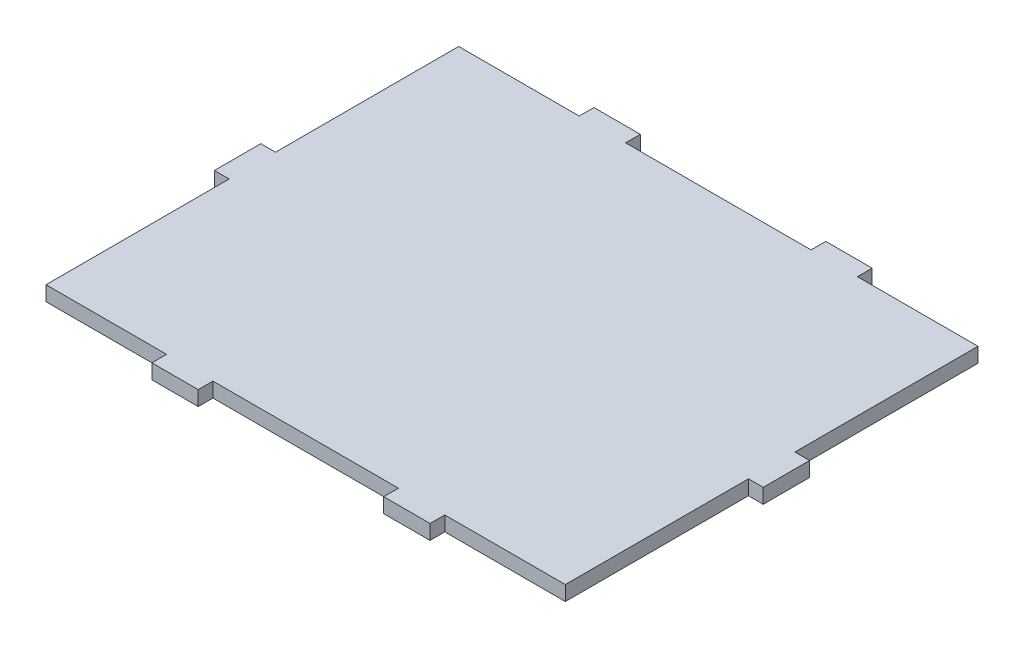
ISO-10303-21;
HEADER;
FILE_DESCRIPTION(('STEP AP214'),'2;1');
FILE_NAME('part.step','',(''),(''),'','','');
FILE_SCHEMA(('AUTOMOTIVE_DESIGN { 1 0 10303 214 1 1 1 1 }'));
ENDSEC;
DATA;
#1=APPLICATION_CONTEXT('core data for automotive mechanical design processes');
#2=APPLICATION_PROTOCOL_DEFINITION('international standard','automotive_design',2000,#1);
#3=PRODUCT_CONTEXT('',#1,'mechanical');
#4=PRODUCT('Part','Part','',(#3));
#5=PRODUCT_RELATED_PRODUCT_CATEGORY('part','',(#4));
#6=PRODUCT_DEFINITION_FORMATION('','',#4);
#7=PRODUCT_DEFINITION_CONTEXT('part definition',#1,'design');
#8=PRODUCT_DEFINITION('design','',#6,#7);
#9=PRODUCT_DEFINITION_SHAPE('','',#8);
#10=(LENGTH_UNIT() NAMED_UNIT(*) SI_UNIT(.MILLI.,.METRE.));
#11=(NAMED_UNIT(*) PLANE_ANGLE_UNIT() SI_UNIT($,.RADIAN.));
#12=(NAMED_UNIT(*) SI_UNIT($,.STERADIAN.) SOLID_ANGLE_UNIT());
#13=UNCERTAINTY_MEASURE_WITH_UNIT(LENGTH_MEASURE(1.E-05),#10,'distance_accuracy_value','');
#14=(GEOMETRIC_REPRESENTATION_CONTEXT(3) GLOBAL_UNCERTAINTY_ASSIGNED_CONTEXT((#13)) GLOBAL_UNIT_ASSIGNED_CONTEXT((#10,
#11,#12)) REPRESENTATION_CONTEXT('',''));
#15=CARTESIAN_POINT('',(0.,0.,0.));
#16=DIRECTION('',(0.,0.,1.));
#17=DIRECTION('',(1.,0.,0.));
#18=AXIS2_PLACEMENT_3D('',#15,#16,#17);
#19=CARTESIAN_POINT('',(56.,3.175,47.675));
#20=DIRECTION('',(-1.,0.,0.));
#21=DIRECTION('',(0.,0.,1.));
#22=AXIS2_PLACEMENT_3D('',#19,#20,#21);
#23=PLANE('',#22);
#24=DIRECTION('',(0.,-1.,0.));
#25=VECTOR('',#24,1.);
#26=CARTESIAN_POINT('',(56.,3.175,5.));
#27=LINE('',#26,#25);
#28=CARTESIAN_POINT('',(56.,3.175,5.));
#29=VERTEX_POINT('',#28);
#30=CARTESIAN_POINT('',(56.,0.,5.));
#31=VERTEX_POINT('',#30);
#32=EDGE_CURVE('E240',#29,#31,#27,.T.);
#33=ORIENTED_EDGE('',*,*,#32,.F.);
#34=DIRECTION('',(0.,0.,-1.));
#35=VECTOR('',#34,1.);
#36=CARTESIAN_POINT('',(56.,3.175,47.675));
#37=LINE('',#36,#35);
#38=CARTESIAN_POINT('',(56.,3.175,44.5));
#39=VERTEX_POINT('',#38);
#40=EDGE_CURVE('E281',#39,#29,#37,.T.);
#41=ORIENTED_EDGE('',*,*,#40,.F.);
#42=DIRECTION('',(0.,1.,0.));
#43=VECTOR('',#42,1.);
#44=CARTESIAN_POINT('',(56.,0.,44.5));
#45=LINE('',#44,#43);
#46=CARTESIAN_POINT('',(56.,0.,44.5));
#47=VERTEX_POINT('',#46);
#48=EDGE_CURVE('E578',#47,#39,#45,.T.);
#49=ORIENTED_EDGE('',*,*,#48,.F.);
#50=DIRECTION('',(0.,0.,-1.));
#51=VECTOR('',#50,1.);
#52=CARTESIAN_POINT('',(56.,0.,47.675));
#53=LINE('',#52,#51);
#54=EDGE_CURVE('E56',#47,#31,#53,.T.);
#55=ORIENTED_EDGE('',*,*,#54,.T.);
#56=EDGE_LOOP('',(#33,#41,#49,#55));
#57=FACE_BOUND('',#56,.T.);
#58=ADVANCED_FACE('F32',(#57),#23,.F.);
#59=DIRECTION('',(0.,1.,0.));
#60=VECTOR('',#59,1.);
#61=CARTESIAN_POINT('',(56.,3.175,-5.));
#62=LINE('',#61,#60);
#63=CARTESIAN_POINT('',(56.,0.,-5.));
#64=VERTEX_POINT('',#63);
#65=CARTESIAN_POINT('',(56.,3.175,-5.));
#66=VERTEX_POINT('',#65);
#67=EDGE_CURVE('E48',#64,#66,#62,.T.);
#68=ORIENTED_EDGE('',*,*,#67,.F.);
#69=CARTESIAN_POINT('',(56.,0.,-44.5));
#70=VERTEX_POINT('',#69);
#71=EDGE_CURVE('E266',#64,#70,#53,.T.);
#72=ORIENTED_EDGE('',*,*,#71,.T.);
#73=DIRECTION('',(0.,1.,0.));
#74=VECTOR('',#73,1.);
#75=CARTESIAN_POINT('',(56.,0.,-44.5));
#76=LINE('',#75,#74);
#77=CARTESIAN_POINT('',(56.,3.175,-44.5));
#78=VERTEX_POINT('',#77);
#79=EDGE_CURVE('E462',#70,#78,#76,.T.);
#80=ORIENTED_EDGE('',*,*,#79,.T.);
#81=EDGE_CURVE('E286',#66,#78,#37,.T.);
#82=ORIENTED_EDGE('',*,*,#81,.F.);
#83=EDGE_LOOP('',(#68,#72,#80,#82));
#84=FACE_BOUND('',#83,.T.);
#85=ADVANCED_FACE('F515',(#84),#23,.F.);
#86=CARTESIAN_POINT('',(-56.,3.175,47.675));
#87=DIRECTION('',(1.,0.,0.));
#88=DIRECTION('',(0.,0.,-1.));
#89=AXIS2_PLACEMENT_3D('',#86,#87,#88);
#90=PLANE('',#89);
#91=DIRECTION('',(0.,-1.,0.));
#92=VECTOR('',#91,1.);
#93=CARTESIAN_POINT('',(-56.,3.175,-5.));
#94=LINE('',#93,#92);
#95=CARTESIAN_POINT('',(-56.,3.175,-5.));
#96=VERTEX_POINT('',#95);
#97=CARTESIAN_POINT('',(-56.,0.,-5.));
#98=VERTEX_POINT('',#97);
#99=EDGE_CURVE('E241',#96,#98,#94,.T.);
#100=ORIENTED_EDGE('',*,*,#99,.F.);
#101=DIRECTION('',(0.,0.,1.));
#102=VECTOR('',#101,1.);
#103=CARTESIAN_POINT('',(-56.,3.175,47.675));
#104=LINE('',#103,#102);
#105=CARTESIAN_POINT('',(-56.,3.175,-44.5));
#106=VERTEX_POINT('',#105);
#107=EDGE_CURVE('E309',#106,#96,#104,.T.);
#108=ORIENTED_EDGE('',*,*,#107,.F.);
#109=DIRECTION('',(0.,1.,0.));
#110=VECTOR('',#109,1.);
#111=CARTESIAN_POINT('',(-56.,0.,-44.5));
#112=LINE('',#111,#110);
#113=CARTESIAN_POINT('',(-56.,0.,-44.5));
#114=VERTEX_POINT('',#113);
#115=EDGE_CURVE('E338',#114,#106,#112,.T.);
#116=ORIENTED_EDGE('',*,*,#115,.F.);
#117=DIRECTION('',(0.,0.,1.));
#118=VECTOR('',#117,1.);
#119=CARTESIAN_POINT('',(-56.,0.,47.675));
#120=LINE('',#119,#118);
#121=EDGE_CURVE('E315',#114,#98,#120,.T.);
#122=ORIENTED_EDGE('',*,*,#121,.T.);
#123=EDGE_LOOP('',(#100,#108,#116,#122));
#124=FACE_BOUND('',#123,.T.);
#125=ADVANCED_FACE('F336',(#124),#90,.F.);
#126=DIRECTION('',(0.,1.,0.));
#127=VECTOR('',#126,1.);
#128=CARTESIAN_POINT('',(-56.,3.175,5.));
#129=LINE('',#128,#127);
#130=CARTESIAN_POINT('',(-56.,0.,5.));
#131=VERTEX_POINT('',#130);
#132=CARTESIAN_POINT('',(-56.,3.175,5.));
#133=VERTEX_POINT('',#132);
#134=EDGE_CURVE('E244',#131,#133,#129,.T.);
#135=ORIENTED_EDGE('',*,*,#134,.F.);
#136=CARTESIAN_POINT('',(-56.,0.,44.5));
#137=VERTEX_POINT('',#136);
#138=EDGE_CURVE('E312',#131,#137,#120,.T.);
#139=ORIENTED_EDGE('',*,*,#138,.T.);
#140=DIRECTION('',(0.,1.,0.));
#141=VECTOR('',#140,1.);
#142=CARTESIAN_POINT('',(-56.,0.,44.5));
#143=LINE('',#142,#141);
#144=CARTESIAN_POINT('',(-56.,3.175,44.5));
#145=VERTEX_POINT('',#144);
#146=EDGE_CURVE('E391',#137,#145,#143,.T.);
#147=ORIENTED_EDGE('',*,*,#146,.T.);
#148=EDGE_CURVE('E303',#133,#145,#104,.T.);
#149=ORIENTED_EDGE('',*,*,#148,.F.);
#150=EDGE_LOOP('',(#135,#139,#147,#149));
#151=FACE_BOUND('',#150,.T.);
#152=ADVANCED_FACE('F390',(#151),#90,.F.);
#153=CARTESIAN_POINT('',(-56.,3.175,47.675));
#154=DIRECTION('',(0.,0.,-1.));
#155=DIRECTION('',(-1.,0.,0.));
#156=AXIS2_PLACEMENT_3D('',#153,#154,#155);
#157=PLANE('',#156);
#158=DIRECTION('',(1.,0.,0.));
#159=VECTOR('',#158,1.);
#160=CARTESIAN_POINT('',(-56.,3.175,47.675));
#161=LINE('',#160,#159);
#162=CARTESIAN_POINT('',(-30.,3.175,47.675));
#163=VERTEX_POINT('',#162);
#164=CARTESIAN_POINT('',(-20.,3.175,47.675));
#165=VERTEX_POINT('',#164);
#166=EDGE_CURVE('E11',#163,#165,#161,.T.);
#167=ORIENTED_EDGE('',*,*,#166,.F.);
#168=DIRECTION('',(0.,1.,0.));
#169=VECTOR('',#168,1.);
#170=CARTESIAN_POINT('',(-30.,0.,47.675));
#171=LINE('',#170,#169);
#172=CARTESIAN_POINT('',(-30.,0.,47.675));
#173=VERTEX_POINT('',#172);
#174=EDGE_CURVE('E397',#173,#163,#171,.T.);
#175=ORIENTED_EDGE('',*,*,#174,.F.);
#176=DIRECTION('',(1.,0.,0.));
#177=VECTOR('',#176,1.);
#178=CARTESIAN_POINT('',(-56.,0.,47.675));
#179=LINE('',#178,#177);
#180=CARTESIAN_POINT('',(-20.,0.,47.675));
#181=VERTEX_POINT('',#180);
#182=EDGE_CURVE('E291',#173,#181,#179,.T.);
#183=ORIENTED_EDGE('',*,*,#182,.T.);
#184=DIRECTION('',(0.,1.,0.));
#185=VECTOR('',#184,1.);
#186=CARTESIAN_POINT('',(-20.,0.,47.675));
#187=LINE('',#186,#185);
#188=EDGE_CURVE('E415',#181,#165,#187,.T.);
#189=ORIENTED_EDGE('',*,*,#188,.T.);
#190=EDGE_LOOP('',(#167,#175,#183,#189));
#191=FACE_BOUND('',#190,.T.);
#192=ADVANCED_FACE('F546',(#191),#157,.F.);
#193=CARTESIAN_POINT('',(-56.,3.175,-47.675));
#194=DIRECTION('',(0.,0.,1.));
#195=DIRECTION('',(1.,0.,0.));
#196=AXIS2_PLACEMENT_3D('',#193,#194,#195);
#197=PLANE('',#196);
#198=DIRECTION('',(-1.,0.,0.));
#199=VECTOR('',#198,1.);
#200=CARTESIAN_POINT('',(-56.,0.,-47.675));
#201=LINE('',#200,#199);
#202=CARTESIAN_POINT('',(-20.,0.,-47.675));
#203=VERTEX_POINT('',#202);
#204=CARTESIAN_POINT('',(-30.,0.,-47.675));
#205=VERTEX_POINT('',#204);
#206=EDGE_CURVE('E508',#203,#205,#201,.T.);
#207=ORIENTED_EDGE('',*,*,#206,.T.);
#208=DIRECTION('',(0.,1.,0.));
#209=VECTOR('',#208,1.);
#210=CARTESIAN_POINT('',(-30.,0.,-47.675));
#211=LINE('',#210,#209);
#212=CARTESIAN_POINT('',(-30.,3.175,-47.675));
#213=VERTEX_POINT('',#212);
#214=EDGE_CURVE('E440',#205,#213,#211,.T.);
#215=ORIENTED_EDGE('',*,*,#214,.T.);
#216=DIRECTION('',(-1.,0.,0.));
#217=VECTOR('',#216,1.);
#218=CARTESIAN_POINT('',(-56.,3.175,-47.675));
#219=LINE('',#218,#217);
#220=CARTESIAN_POINT('',(-20.,3.175,-47.675));
#221=VERTEX_POINT('',#220);
#222=EDGE_CURVE('E285',#221,#213,#219,.T.);
#223=ORIENTED_EDGE('',*,*,#222,.F.);
#224=DIRECTION('',(0.,1.,0.));
#225=VECTOR('',#224,1.);
#226=CARTESIAN_POINT('',(-20.,0.,-47.675));
#227=LINE('',#226,#225);
#228=EDGE_CURVE('E483',#203,#221,#227,.T.);
#229=ORIENTED_EDGE('',*,*,#228,.F.);
#230=EDGE_LOOP('',(#207,#215,#223,#229));
#231=FACE_BOUND('',#230,.T.);
#232=ADVANCED_FACE('F551',(#231),#197,.F.);
#233=CARTESIAN_POINT('',(30.,3.175,-47.675));
#234=VERTEX_POINT('',#233);
#235=CARTESIAN_POINT('',(20.,3.175,-47.675));
#236=VERTEX_POINT('',#235);
#237=EDGE_CURVE('E289',#234,#236,#219,.T.);
#238=ORIENTED_EDGE('',*,*,#237,.F.);
#239=DIRECTION('',(0.,1.,0.));
#240=VECTOR('',#239,1.);
#241=CARTESIAN_POINT('',(30.,0.,-47.675));
#242=LINE('',#241,#240);
#243=CARTESIAN_POINT('',(30.,0.,-47.675));
#244=VERTEX_POINT('',#243);
#245=EDGE_CURVE('E459',#244,#234,#242,.T.);
#246=ORIENTED_EDGE('',*,*,#245,.F.);
#247=CARTESIAN_POINT('',(20.,0.,-47.675));
#248=VERTEX_POINT('',#247);
#249=EDGE_CURVE('E316',#244,#248,#201,.T.);
#250=ORIENTED_EDGE('',*,*,#249,.T.);
#251=DIRECTION('',(0.,1.,0.));
#252=VECTOR('',#251,1.);
#253=CARTESIAN_POINT('',(20.,0.,-47.675));
#254=LINE('',#253,#252);
#255=EDGE_CURVE('E485',#248,#236,#254,.T.);
#256=ORIENTED_EDGE('',*,*,#255,.T.);
#257=EDGE_LOOP('',(#238,#246,#250,#256));
#258=FACE_BOUND('',#257,.T.);
#259=ADVANCED_FACE('F505',(#258),#197,.F.);
#260=CARTESIAN_POINT('',(20.,0.,47.675));
#261=VERTEX_POINT('',#260);
#262=CARTESIAN_POINT('',(30.,0.,47.675));
#263=VERTEX_POINT('',#262);
#264=EDGE_CURVE('E321',#261,#263,#179,.T.);
#265=ORIENTED_EDGE('',*,*,#264,.T.);
#266=DIRECTION('',(0.,1.,0.));
#267=VECTOR('',#266,1.);
#268=CARTESIAN_POINT('',(30.,0.,47.675));
#269=LINE('',#268,#267);
#270=CARTESIAN_POINT('',(30.,3.175,47.675));
#271=VERTEX_POINT('',#270);
#272=EDGE_CURVE('E576',#263,#271,#269,.T.);
#273=ORIENTED_EDGE('',*,*,#272,.T.);
#274=CARTESIAN_POINT('',(20.,3.175,47.675));
#275=VERTEX_POINT('',#274);
#276=EDGE_CURVE('E40',#275,#271,#161,.T.);
#277=ORIENTED_EDGE('',*,*,#276,.F.);
#278=DIRECTION('',(0.,1.,0.));
#279=VECTOR('',#278,1.);
#280=CARTESIAN_POINT('',(20.,0.,47.675));
#281=LINE('',#280,#279);
#282=EDGE_CURVE('E428',#261,#275,#281,.T.);
#283=ORIENTED_EDGE('',*,*,#282,.F.);
#284=EDGE_LOOP('',(#265,#273,#277,#283));
#285=FACE_BOUND('',#284,.T.);
#286=ADVANCED_FACE('F548',(#285),#157,.F.);
#287=CARTESIAN_POINT('',(0.,3.175,0.));
#288=DIRECTION('',(0.,-1.,0.));
#289=DIRECTION('',(0.,0.,-1.));
#290=AXIS2_PLACEMENT_3D('',#287,#288,#289);
#291=PLANE('',#290);
#292=ORIENTED_EDGE('',*,*,#276,.T.);
#293=DIRECTION('',(0.,0.,1.));
#294=VECTOR('',#293,1.);
#295=CARTESIAN_POINT('',(30.,3.175,44.5));
#296=LINE('',#295,#294);
#297=CARTESIAN_POINT('',(30.,3.175,44.5));
#298=VERTEX_POINT('',#297);
#299=EDGE_CURVE('E347',#298,#271,#296,.T.);
#300=ORIENTED_EDGE('',*,*,#299,.F.);
#301=DIRECTION('',(-1.,0.,0.));
#302=VECTOR('',#301,1.);
#303=CARTESIAN_POINT('',(30.,3.175,44.5));
#304=LINE('',#303,#302);
#305=EDGE_CURVE('E284',#39,#298,#304,.T.);
#306=ORIENTED_EDGE('',*,*,#305,.F.);
#307=ORIENTED_EDGE('',*,*,#40,.T.);
#308=DIRECTION('',(-1.,0.,0.));
#309=VECTOR('',#308,1.);
#310=CARTESIAN_POINT('',(59.175,3.175,5.));
#311=LINE('',#310,#309);
#312=CARTESIAN_POINT('',(59.175,3.175,5.));
#313=VERTEX_POINT('',#312);
#314=EDGE_CURVE('E254',#313,#29,#311,.T.);
#315=ORIENTED_EDGE('',*,*,#314,.F.);
#316=DIRECTION('',(0.,0.,1.));
#317=VECTOR('',#316,1.);
#318=CARTESIAN_POINT('',(59.175,3.175,5.));
#319=LINE('',#318,#317);
#320=CARTESIAN_POINT('',(59.175,3.175,-5.));
#321=VERTEX_POINT('',#320);
#322=EDGE_CURVE('E234',#321,#313,#319,.T.);
#323=ORIENTED_EDGE('',*,*,#322,.F.);
#324=DIRECTION('',(-1.,0.,0.));
#325=VECTOR('',#324,1.);
#326=CARTESIAN_POINT('',(59.175,3.175,-5.));
#327=LINE('',#326,#325);
#328=EDGE_CURVE('E246',#321,#66,#327,.T.);
#329=ORIENTED_EDGE('',*,*,#328,.T.);
#330=ORIENTED_EDGE('',*,*,#81,.T.);
#331=DIRECTION('',(1.,0.,0.));
#332=VECTOR('',#331,1.);
#333=CARTESIAN_POINT('',(30.,3.175,-44.5));
#334=LINE('',#333,#332);
#335=CARTESIAN_POINT('',(30.,3.175,-44.5));
#336=VERTEX_POINT('',#335);
#337=EDGE_CURVE('E451',#336,#78,#334,.T.);
#338=ORIENTED_EDGE('',*,*,#337,.F.);
#339=DIRECTION('',(0.,0.,1.));
#340=VECTOR('',#339,1.);
#341=CARTESIAN_POINT('',(30.,3.175,-47.675));
#342=LINE('',#341,#340);
#343=EDGE_CURVE('E443',#234,#336,#342,.T.);
#344=ORIENTED_EDGE('',*,*,#343,.F.);
#345=ORIENTED_EDGE('',*,*,#237,.T.);
#346=DIRECTION('',(0.,0.,-1.));
#347=VECTOR('',#346,1.);
#348=CARTESIAN_POINT('',(20.,3.175,-47.675));
#349=LINE('',#348,#347);
#350=CARTESIAN_POINT('',(20.,3.175,-44.5));
#351=VERTEX_POINT('',#350);
#352=EDGE_CURVE('E470',#351,#236,#349,.T.);
#353=ORIENTED_EDGE('',*,*,#352,.F.);
#354=DIRECTION('',(1.,0.,0.));
#355=VECTOR('',#354,1.);
#356=CARTESIAN_POINT('',(-20.,3.175,-44.5));
#357=LINE('',#356,#355);
#358=CARTESIAN_POINT('',(-20.,3.175,-44.5));
#359=VERTEX_POINT('',#358);
#360=EDGE_CURVE('E478',#359,#351,#357,.T.);
#361=ORIENTED_EDGE('',*,*,#360,.F.);
#362=DIRECTION('',(0.,0.,1.));
#363=VECTOR('',#362,1.);
#364=CARTESIAN_POINT('',(-20.,3.175,-47.675));
#365=LINE('',#364,#363);
#366=EDGE_CURVE('E461',#221,#359,#365,.T.);
#367=ORIENTED_EDGE('',*,*,#366,.F.);
#368=ORIENTED_EDGE('',*,*,#222,.T.);
#369=DIRECTION('',(0.,0.,-1.));
#370=VECTOR('',#369,1.);
#371=CARTESIAN_POINT('',(-30.,3.175,-47.675));
#372=LINE('',#371,#370);
#373=CARTESIAN_POINT('',(-30.,3.175,-44.5));
#374=VERTEX_POINT('',#373);
#375=EDGE_CURVE('E434',#374,#213,#372,.T.);
#376=ORIENTED_EDGE('',*,*,#375,.F.);
#377=DIRECTION('',(1.,0.,0.));
#378=VECTOR('',#377,1.);
#379=CARTESIAN_POINT('',(-56.,3.175,-44.5));
#380=LINE('',#379,#378);
#381=EDGE_CURVE('E425',#106,#374,#380,.T.);
#382=ORIENTED_EDGE('',*,*,#381,.F.);
#383=ORIENTED_EDGE('',*,*,#107,.T.);
#384=DIRECTION('',(1.,0.,0.));
#385=VECTOR('',#384,1.);
#386=CARTESIAN_POINT('',(-59.175,3.175,-5.));
#387=LINE('',#386,#385);
#388=CARTESIAN_POINT('',(-59.175,3.175,-5.));
#389=VERTEX_POINT('',#388);
#390=EDGE_CURVE('E353',#389,#96,#387,.T.);
#391=ORIENTED_EDGE('',*,*,#390,.F.);
#392=DIRECTION('',(0.,0.,-1.));
#393=VECTOR('',#392,1.);
#394=CARTESIAN_POINT('',(-59.175,3.175,-5.));
#395=LINE('',#394,#393);
#396=CARTESIAN_POINT('',(-59.175,3.175,5.));
#397=VERTEX_POINT('',#396);
#398=EDGE_CURVE('E356',#397,#389,#395,.T.);
#399=ORIENTED_EDGE('',*,*,#398,.F.);
#400=DIRECTION('',(1.,0.,0.));
#401=VECTOR('',#400,1.);
#402=CARTESIAN_POINT('',(-59.175,3.175,5.));
#403=LINE('',#402,#401);
#404=EDGE_CURVE('E355',#397,#133,#403,.T.);
#405=ORIENTED_EDGE('',*,*,#404,.T.);
#406=ORIENTED_EDGE('',*,*,#148,.T.);
#407=DIRECTION('',(-1.,0.,0.));
#408=VECTOR('',#407,1.);
#409=CARTESIAN_POINT('',(-30.,3.175,44.5));
#410=LINE('',#409,#408);
#411=CARTESIAN_POINT('',(-30.,3.175,44.5));
#412=VERTEX_POINT('',#411);
#413=EDGE_CURVE('E396',#412,#145,#410,.T.);
#414=ORIENTED_EDGE('',*,*,#413,.F.);
#415=DIRECTION('',(0.,0.,-1.));
#416=VECTOR('',#415,1.);
#417=CARTESIAN_POINT('',(-30.,3.175,44.5));
#418=LINE('',#417,#416);
#419=EDGE_CURVE('E566',#163,#412,#418,.T.);
#420=ORIENTED_EDGE('',*,*,#419,.F.);
#421=ORIENTED_EDGE('',*,*,#166,.T.);
#422=DIRECTION('',(0.,0.,1.));
#423=VECTOR('',#422,1.);
#424=CARTESIAN_POINT('',(-20.,3.175,47.675));
#425=LINE('',#424,#423);
#426=CARTESIAN_POINT('',(-20.,3.175,44.5));
#427=VERTEX_POINT('',#426);
#428=EDGE_CURVE('E400',#427,#165,#425,.T.);
#429=ORIENTED_EDGE('',*,*,#428,.F.);
#430=DIRECTION('',(-1.,0.,0.));
#431=VECTOR('',#430,1.);
#432=CARTESIAN_POINT('',(-20.,3.175,44.5));
#433=LINE('',#432,#431);
#434=CARTESIAN_POINT('',(20.,3.175,44.5));
#435=VERTEX_POINT('',#434);
#436=EDGE_CURVE('E409',#435,#427,#433,.T.);
#437=ORIENTED_EDGE('',*,*,#436,.F.);
#438=DIRECTION('',(0.,0.,-1.));
#439=VECTOR('',#438,1.);
#440=CARTESIAN_POINT('',(20.,3.175,47.675));
#441=LINE('',#440,#439);
#442=EDGE_CURVE('E418',#275,#435,#441,.T.);
#443=ORIENTED_EDGE('',*,*,#442,.F.);
#444=EDGE_LOOP('',(#292,#300,#306,#307,#315,#323,#329,#330,#338,#344,#345,#353,#361,#367,#368,
#376,#382,#383,#391,#399,#405,#406,#414,#420,#421,#429,#437,#443));
#445=FACE_BOUND('',#444,.T.);
#446=ADVANCED_FACE('F277',(#445),#291,.F.);
#447=CARTESIAN_POINT('',(0.,0.,0.));
#448=DIRECTION('',(0.,-1.,0.));
#449=DIRECTION('',(0.,0.,-1.));
#450=AXIS2_PLACEMENT_3D('',#447,#448,#449);
#451=PLANE('',#450);
#452=DIRECTION('',(0.,0.,1.));
#453=VECTOR('',#452,1.);
#454=CARTESIAN_POINT('',(30.,0.,44.5));
#455=LINE('',#454,#453);
#456=CARTESIAN_POINT('',(30.,0.,44.5));
#457=VERTEX_POINT('',#456);
#458=EDGE_CURVE('E369',#457,#263,#455,.T.);
#459=ORIENTED_EDGE('',*,*,#458,.T.);
#460=ORIENTED_EDGE('',*,*,#264,.F.);
#461=DIRECTION('',(0.,0.,-1.));
#462=VECTOR('',#461,1.);
#463=CARTESIAN_POINT('',(20.,0.,47.675));
#464=LINE('',#463,#462);
#465=CARTESIAN_POINT('',(20.,0.,44.5));
#466=VERTEX_POINT('',#465);
#467=EDGE_CURVE('E408',#261,#466,#464,.T.);
#468=ORIENTED_EDGE('',*,*,#467,.T.);
#469=DIRECTION('',(-1.,0.,0.));
#470=VECTOR('',#469,1.);
#471=CARTESIAN_POINT('',(-20.,0.,44.5));
#472=LINE('',#471,#470);
#473=CARTESIAN_POINT('',(-20.,0.,44.5));
#474=VERTEX_POINT('',#473);
#475=EDGE_CURVE('E412',#466,#474,#472,.T.);
#476=ORIENTED_EDGE('',*,*,#475,.T.);
#477=DIRECTION('',(0.,0.,1.));
#478=VECTOR('',#477,1.);
#479=CARTESIAN_POINT('',(-20.,0.,47.675));
#480=LINE('',#479,#478);
#481=EDGE_CURVE('E405',#474,#181,#480,.T.);
#482=ORIENTED_EDGE('',*,*,#481,.T.);
#483=ORIENTED_EDGE('',*,*,#182,.F.);
#484=DIRECTION('',(0.,0.,-1.));
#485=VECTOR('',#484,1.);
#486=CARTESIAN_POINT('',(-30.,0.,44.5));
#487=LINE('',#486,#485);
#488=CARTESIAN_POINT('',(-30.,0.,44.5));
#489=VERTEX_POINT('',#488);
#490=EDGE_CURVE('E586',#173,#489,#487,.T.);
#491=ORIENTED_EDGE('',*,*,#490,.T.);
#492=DIRECTION('',(-1.,0.,0.));
#493=VECTOR('',#492,1.);
#494=CARTESIAN_POINT('',(-30.,0.,44.5));
#495=LINE('',#494,#493);
#496=EDGE_CURVE('E386',#489,#137,#495,.T.);
#497=ORIENTED_EDGE('',*,*,#496,.T.);
#498=ORIENTED_EDGE('',*,*,#138,.F.);
#499=DIRECTION('',(1.,0.,0.));
#500=VECTOR('',#499,1.);
#501=CARTESIAN_POINT('',(-59.175,0.,5.));
#502=LINE('',#501,#500);
#503=CARTESIAN_POINT('',(-59.175,0.,5.));
#504=VERTEX_POINT('',#503);
#505=EDGE_CURVE('E348',#504,#131,#502,.T.);
#506=ORIENTED_EDGE('',*,*,#505,.F.);
#507=DIRECTION('',(0.,0.,1.));
#508=VECTOR('',#507,1.);
#509=CARTESIAN_POINT('',(-59.175,0.,-5.));
#510=LINE('',#509,#508);
#511=CARTESIAN_POINT('',(-59.175,0.,-5.));
#512=VERTEX_POINT('',#511);
#513=EDGE_CURVE('E343',#512,#504,#510,.T.);
#514=ORIENTED_EDGE('',*,*,#513,.F.);
#515=DIRECTION('',(1.,0.,0.));
#516=VECTOR('',#515,1.);
#517=CARTESIAN_POINT('',(-59.175,0.,-5.));
#518=LINE('',#517,#516);
#519=EDGE_CURVE('E341',#512,#98,#518,.T.);
#520=ORIENTED_EDGE('',*,*,#519,.T.);
#521=ORIENTED_EDGE('',*,*,#121,.F.);
#522=DIRECTION('',(1.,0.,0.));
#523=VECTOR('',#522,1.);
#524=CARTESIAN_POINT('',(-56.,0.,-44.5));
#525=LINE('',#524,#523);
#526=CARTESIAN_POINT('',(-30.,0.,-44.5));
#527=VERTEX_POINT('',#526);
#528=EDGE_CURVE('E431',#114,#527,#525,.T.);
#529=ORIENTED_EDGE('',*,*,#528,.T.);
#530=DIRECTION('',(0.,0.,-1.));
#531=VECTOR('',#530,1.);
#532=CARTESIAN_POINT('',(-30.,0.,-47.675));
#533=LINE('',#532,#531);
#534=EDGE_CURVE('E433',#527,#205,#533,.T.);
#535=ORIENTED_EDGE('',*,*,#534,.T.);
#536=ORIENTED_EDGE('',*,*,#206,.F.);
#537=DIRECTION('',(0.,0.,1.));
#538=VECTOR('',#537,1.);
#539=CARTESIAN_POINT('',(-20.,0.,-47.675));
#540=LINE('',#539,#538);
#541=CARTESIAN_POINT('',(-20.,0.,-44.5));
#542=VERTEX_POINT('',#541);
#543=EDGE_CURVE('E466',#203,#542,#540,.T.);
#544=ORIENTED_EDGE('',*,*,#543,.T.);
#545=DIRECTION('',(1.,0.,0.));
#546=VECTOR('',#545,1.);
#547=CARTESIAN_POINT('',(-20.,0.,-44.5));
#548=LINE('',#547,#546);
#549=CARTESIAN_POINT('',(20.,0.,-44.5));
#550=VERTEX_POINT('',#549);
#551=EDGE_CURVE('E469',#542,#550,#548,.T.);
#552=ORIENTED_EDGE('',*,*,#551,.T.);
#553=DIRECTION('',(0.,0.,-1.));
#554=VECTOR('',#553,1.);
#555=CARTESIAN_POINT('',(20.,0.,-47.675));
#556=LINE('',#555,#554);
#557=EDGE_CURVE('E473',#550,#248,#556,.T.);
#558=ORIENTED_EDGE('',*,*,#557,.T.);
#559=ORIENTED_EDGE('',*,*,#249,.F.);
#560=DIRECTION('',(0.,0.,1.));
#561=VECTOR('',#560,1.);
#562=CARTESIAN_POINT('',(30.,0.,-47.675));
#563=LINE('',#562,#561);
#564=CARTESIAN_POINT('',(30.,0.,-44.5));
#565=VERTEX_POINT('',#564);
#566=EDGE_CURVE('E447',#244,#565,#563,.T.);
#567=ORIENTED_EDGE('',*,*,#566,.T.);
#568=DIRECTION('',(1.,0.,0.));
#569=VECTOR('',#568,1.);
#570=CARTESIAN_POINT('',(30.,0.,-44.5));
#571=LINE('',#570,#569);
#572=EDGE_CURVE('E450',#565,#70,#571,.T.);
#573=ORIENTED_EDGE('',*,*,#572,.T.);
#574=ORIENTED_EDGE('',*,*,#71,.F.);
#575=DIRECTION('',(-1.,0.,0.));
#576=VECTOR('',#575,1.);
#577=CARTESIAN_POINT('',(59.175,0.,-5.));
#578=LINE('',#577,#576);
#579=CARTESIAN_POINT('',(59.175,0.,-5.));
#580=VERTEX_POINT('',#579);
#581=EDGE_CURVE('E225',#580,#64,#578,.T.);
#582=ORIENTED_EDGE('',*,*,#581,.F.);
#583=DIRECTION('',(0.,0.,-1.));
#584=VECTOR('',#583,1.);
#585=CARTESIAN_POINT('',(59.175,0.,5.));
#586=LINE('',#585,#584);
#587=CARTESIAN_POINT('',(59.175,0.,5.));
#588=VERTEX_POINT('',#587);
#589=EDGE_CURVE('E217',#588,#580,#586,.T.);
#590=ORIENTED_EDGE('',*,*,#589,.F.);
#591=DIRECTION('',(-1.,0.,0.));
#592=VECTOR('',#591,1.);
#593=CARTESIAN_POINT('',(59.175,0.,5.));
#594=LINE('',#593,#592);
#595=EDGE_CURVE('E222',#588,#31,#594,.T.);
#596=ORIENTED_EDGE('',*,*,#595,.T.);
#597=ORIENTED_EDGE('',*,*,#54,.F.);
#598=DIRECTION('',(-1.,0.,0.));
#599=VECTOR('',#598,1.);
#600=CARTESIAN_POINT('',(30.,0.,44.5));
#601=LINE('',#600,#599);
#602=EDGE_CURVE('E579',#47,#457,#601,.T.);
#603=ORIENTED_EDGE('',*,*,#602,.T.);
#604=EDGE_LOOP('',(#459,#460,#468,#476,#482,#483,#491,#497,#498,#506,#514,#520,#521,#529,#535,
#536,#544,#552,#558,#559,#567,#573,#574,#582,#590,#596,#597,#603));
#605=FACE_BOUND('',#604,.T.);
#606=ADVANCED_FACE('F220',(#605),#451,.T.);
#607=CARTESIAN_POINT('',(-20.,0.,-47.675));
#608=DIRECTION('',(-1.,0.,0.));
#609=DIRECTION('',(0.,0.,1.));
#610=AXIS2_PLACEMENT_3D('',#607,#608,#609);
#611=PLANE('',#610);
#612=ORIENTED_EDGE('',*,*,#366,.T.);
#613=DIRECTION('',(0.,1.,0.));
#614=VECTOR('',#613,1.);
#615=CARTESIAN_POINT('',(-20.,0.,-44.5));
#616=LINE('',#615,#614);
#617=EDGE_CURVE('E299',#542,#359,#616,.T.);
#618=ORIENTED_EDGE('',*,*,#617,.F.);
#619=ORIENTED_EDGE('',*,*,#543,.F.);
#620=ORIENTED_EDGE('',*,*,#228,.T.);
#621=EDGE_LOOP('',(#612,#618,#619,#620));
#622=FACE_BOUND('',#621,.T.);
#623=ADVANCED_FACE('F497',(#622),#611,.F.);
#624=CARTESIAN_POINT('',(20.,0.,-47.675));
#625=DIRECTION('',(1.,0.,0.));
#626=DIRECTION('',(0.,0.,-1.));
#627=AXIS2_PLACEMENT_3D('',#624,#625,#626);
#628=PLANE('',#627);
#629=ORIENTED_EDGE('',*,*,#352,.T.);
#630=ORIENTED_EDGE('',*,*,#255,.F.);
#631=ORIENTED_EDGE('',*,*,#557,.F.);
#632=DIRECTION('',(0.,1.,0.));
#633=VECTOR('',#632,1.);
#634=CARTESIAN_POINT('',(20.,0.,-44.5));
#635=LINE('',#634,#633);
#636=EDGE_CURVE('E487',#550,#351,#635,.T.);
#637=ORIENTED_EDGE('',*,*,#636,.T.);
#638=EDGE_LOOP('',(#629,#630,#631,#637));
#639=FACE_BOUND('',#638,.T.);
#640=ADVANCED_FACE('F503',(#639),#628,.F.);
#641=CARTESIAN_POINT('',(-20.,0.,-44.5));
#642=DIRECTION('',(0.,0.,1.));
#643=DIRECTION('',(1.,0.,0.));
#644=AXIS2_PLACEMENT_3D('',#641,#642,#643);
#645=PLANE('',#644);
#646=ORIENTED_EDGE('',*,*,#360,.T.);
#647=ORIENTED_EDGE('',*,*,#636,.F.);
#648=ORIENTED_EDGE('',*,*,#551,.F.);
#649=ORIENTED_EDGE('',*,*,#617,.T.);
#650=EDGE_LOOP('',(#646,#647,#648,#649));
#651=FACE_BOUND('',#650,.T.);
#652=ADVANCED_FACE('F492',(#651),#645,.F.);
#653=CARTESIAN_POINT('',(30.,0.,-47.675));
#654=DIRECTION('',(-1.,0.,0.));
#655=DIRECTION('',(0.,0.,1.));
#656=AXIS2_PLACEMENT_3D('',#653,#654,#655);
#657=PLANE('',#656);
#658=ORIENTED_EDGE('',*,*,#343,.T.);
#659=DIRECTION('',(0.,1.,0.));
#660=VECTOR('',#659,1.);
#661=CARTESIAN_POINT('',(30.,0.,-44.5));
#662=LINE('',#661,#660);
#663=EDGE_CURVE('E454',#565,#336,#662,.T.);
#664=ORIENTED_EDGE('',*,*,#663,.F.);
#665=ORIENTED_EDGE('',*,*,#566,.F.);
#666=ORIENTED_EDGE('',*,*,#245,.T.);
#667=EDGE_LOOP('',(#658,#664,#665,#666));
#668=FACE_BOUND('',#667,.T.);
#669=ADVANCED_FACE('F521',(#668),#657,.F.);
#670=CARTESIAN_POINT('',(30.,0.,-44.5));
#671=DIRECTION('',(0.,0.,1.));
#672=DIRECTION('',(1.,0.,0.));
#673=AXIS2_PLACEMENT_3D('',#670,#671,#672);
#674=PLANE('',#673);
#675=ORIENTED_EDGE('',*,*,#337,.T.);
#676=ORIENTED_EDGE('',*,*,#79,.F.);
#677=ORIENTED_EDGE('',*,*,#572,.F.);
#678=ORIENTED_EDGE('',*,*,#663,.T.);
#679=EDGE_LOOP('',(#675,#676,#677,#678));
#680=FACE_BOUND('',#679,.T.);
#681=ADVANCED_FACE('F518',(#680),#674,.F.);
#682=CARTESIAN_POINT('',(-30.,0.,-47.675));
#683=DIRECTION('',(1.,0.,0.));
#684=DIRECTION('',(0.,0.,-1.));
#685=AXIS2_PLACEMENT_3D('',#682,#683,#684);
#686=PLANE('',#685);
#687=ORIENTED_EDGE('',*,*,#375,.T.);
#688=ORIENTED_EDGE('',*,*,#214,.F.);
#689=ORIENTED_EDGE('',*,*,#534,.F.);
#690=DIRECTION('',(0.,1.,0.));
#691=VECTOR('',#690,1.);
#692=CARTESIAN_POINT('',(-30.,0.,-44.5));
#693=LINE('',#692,#691);
#694=EDGE_CURVE('E444',#527,#374,#693,.T.);
#695=ORIENTED_EDGE('',*,*,#694,.T.);
#696=EDGE_LOOP('',(#687,#688,#689,#695));
#697=FACE_BOUND('',#696,.T.);
#698=ADVANCED_FACE('F528',(#697),#686,.F.);
#699=CARTESIAN_POINT('',(-56.,0.,-44.5));
#700=DIRECTION('',(0.,0.,1.));
#701=DIRECTION('',(1.,0.,0.));
#702=AXIS2_PLACEMENT_3D('',#699,#700,#701);
#703=PLANE('',#702);
#704=ORIENTED_EDGE('',*,*,#381,.T.);
#705=ORIENTED_EDGE('',*,*,#694,.F.);
#706=ORIENTED_EDGE('',*,*,#528,.F.);
#707=ORIENTED_EDGE('',*,*,#115,.T.);
#708=EDGE_LOOP('',(#704,#705,#706,#707));
#709=FACE_BOUND('',#708,.T.);
#710=ADVANCED_FACE('F616',(#709),#703,.F.);
#711=CARTESIAN_POINT('',(-20.,0.,47.675));
#712=DIRECTION('',(-1.,0.,0.));
#713=DIRECTION('',(0.,0.,1.));
#714=AXIS2_PLACEMENT_3D('',#711,#712,#713);
#715=PLANE('',#714);
#716=ORIENTED_EDGE('',*,*,#428,.T.);
#717=ORIENTED_EDGE('',*,*,#188,.F.);
#718=ORIENTED_EDGE('',*,*,#481,.F.);
#719=DIRECTION('',(0.,1.,0.));
#720=VECTOR('',#719,1.);
#721=CARTESIAN_POINT('',(-20.,0.,44.5));
#722=LINE('',#721,#720);
#723=EDGE_CURVE('E423',#474,#427,#722,.T.);
#724=ORIENTED_EDGE('',*,*,#723,.T.);
#725=EDGE_LOOP('',(#716,#717,#718,#724));
#726=FACE_BOUND('',#725,.T.);
#727=ADVANCED_FACE('F568',(#726),#715,.F.);
#728=CARTESIAN_POINT('',(-20.,0.,44.5));
#729=DIRECTION('',(0.,0.,-1.));
#730=DIRECTION('',(-1.,0.,0.));
#731=AXIS2_PLACEMENT_3D('',#728,#729,#730);
#732=PLANE('',#731);
#733=ORIENTED_EDGE('',*,*,#436,.T.);
#734=ORIENTED_EDGE('',*,*,#723,.F.);
#735=ORIENTED_EDGE('',*,*,#475,.F.);
#736=DIRECTION('',(0.,1.,0.));
#737=VECTOR('',#736,1.);
#738=CARTESIAN_POINT('',(20.,0.,44.5));
#739=LINE('',#738,#737);
#740=EDGE_CURVE('E426',#466,#435,#739,.T.);
#741=ORIENTED_EDGE('',*,*,#740,.T.);
#742=EDGE_LOOP('',(#733,#734,#735,#741));
#743=FACE_BOUND('',#742,.T.);
#744=ADVANCED_FACE('F571',(#743),#732,.F.);
#745=CARTESIAN_POINT('',(20.,0.,47.675));
#746=DIRECTION('',(1.,0.,0.));
#747=DIRECTION('',(0.,0.,-1.));
#748=AXIS2_PLACEMENT_3D('',#745,#746,#747);
#749=PLANE('',#748);
#750=ORIENTED_EDGE('',*,*,#442,.T.);
#751=ORIENTED_EDGE('',*,*,#740,.F.);
#752=ORIENTED_EDGE('',*,*,#467,.F.);
#753=ORIENTED_EDGE('',*,*,#282,.T.);
#754=EDGE_LOOP('',(#750,#751,#752,#753));
#755=FACE_BOUND('',#754,.T.);
#756=ADVANCED_FACE('F609',(#755),#749,.F.);
#757=CARTESIAN_POINT('',(-30.,0.,44.5));
#758=DIRECTION('',(1.,0.,0.));
#759=DIRECTION('',(0.,0.,-1.));
#760=AXIS2_PLACEMENT_3D('',#757,#758,#759);
#761=PLANE('',#760);
#762=ORIENTED_EDGE('',*,*,#419,.T.);
#763=DIRECTION('',(0.,1.,0.));
#764=VECTOR('',#763,1.);
#765=CARTESIAN_POINT('',(-30.,0.,44.5));
#766=LINE('',#765,#764);
#767=EDGE_CURVE('E398',#489,#412,#766,.T.);
#768=ORIENTED_EDGE('',*,*,#767,.F.);
#769=ORIENTED_EDGE('',*,*,#490,.F.);
#770=ORIENTED_EDGE('',*,*,#174,.T.);
#771=EDGE_LOOP('',(#762,#768,#769,#770));
#772=FACE_BOUND('',#771,.T.);
#773=ADVANCED_FACE('F603',(#772),#761,.F.);
#774=CARTESIAN_POINT('',(-30.,0.,44.5));
#775=DIRECTION('',(0.,0.,-1.));
#776=DIRECTION('',(-1.,0.,0.));
#777=AXIS2_PLACEMENT_3D('',#774,#775,#776);
#778=PLANE('',#777);
#779=ORIENTED_EDGE('',*,*,#413,.T.);
#780=ORIENTED_EDGE('',*,*,#146,.F.);
#781=ORIENTED_EDGE('',*,*,#496,.F.);
#782=ORIENTED_EDGE('',*,*,#767,.T.);
#783=EDGE_LOOP('',(#779,#780,#781,#782));
#784=FACE_BOUND('',#783,.T.);
#785=ADVANCED_FACE('F394',(#784),#778,.F.);
#786=CARTESIAN_POINT('',(30.,0.,44.5));
#787=DIRECTION('',(-1.,0.,0.));
#788=DIRECTION('',(0.,0.,1.));
#789=AXIS2_PLACEMENT_3D('',#786,#787,#788);
#790=PLANE('',#789);
#791=ORIENTED_EDGE('',*,*,#299,.T.);
#792=ORIENTED_EDGE('',*,*,#272,.F.);
#793=ORIENTED_EDGE('',*,*,#458,.F.);
#794=DIRECTION('',(0.,1.,0.));
#795=VECTOR('',#794,1.);
#796=CARTESIAN_POINT('',(30.,0.,44.5));
#797=LINE('',#796,#795);
#798=EDGE_CURVE('E581',#457,#298,#797,.T.);
#799=ORIENTED_EDGE('',*,*,#798,.T.);
#800=EDGE_LOOP('',(#791,#792,#793,#799));
#801=FACE_BOUND('',#800,.T.);
#802=ADVANCED_FACE('F593',(#801),#790,.F.);
#803=CARTESIAN_POINT('',(30.,0.,44.5));
#804=DIRECTION('',(0.,0.,-1.));
#805=DIRECTION('',(-1.,0.,0.));
#806=AXIS2_PLACEMENT_3D('',#803,#804,#805);
#807=PLANE('',#806);
#808=ORIENTED_EDGE('',*,*,#305,.T.);
#809=ORIENTED_EDGE('',*,*,#798,.F.);
#810=ORIENTED_EDGE('',*,*,#602,.F.);
#811=ORIENTED_EDGE('',*,*,#48,.T.);
#812=EDGE_LOOP('',(#808,#809,#810,#811));
#813=FACE_BOUND('',#812,.T.);
#814=ADVANCED_FACE('F595',(#813),#807,.F.);
#815=CARTESIAN_POINT('',(-59.175,3.175,-5.));
#816=DIRECTION('',(0.,0.,1.));
#817=DIRECTION('',(0.,-1.,0.));
#818=AXIS2_PLACEMENT_3D('',#815,#816,#817);
#819=PLANE('',#818);
#820=ORIENTED_EDGE('',*,*,#99,.T.);
#821=ORIENTED_EDGE('',*,*,#519,.F.);
#822=DIRECTION('',(0.,-1.,0.));
#823=VECTOR('',#822,1.);
#824=CARTESIAN_POINT('',(-59.175,3.175,-5.));
#825=LINE('',#824,#823);
#826=EDGE_CURVE('E261',#389,#512,#825,.T.);
#827=ORIENTED_EDGE('',*,*,#826,.F.);
#828=ORIENTED_EDGE('',*,*,#390,.T.);
#829=EDGE_LOOP('',(#820,#821,#827,#828));
#830=FACE_BOUND('',#829,.T.);
#831=ADVANCED_FACE('F351',(#830),#819,.F.);
#832=CARTESIAN_POINT('',(-59.175,3.175,5.));
#833=DIRECTION('',(0.,0.,-1.));
#834=DIRECTION('',(0.,1.,0.));
#835=AXIS2_PLACEMENT_3D('',#832,#833,#834);
#836=PLANE('',#835);
#837=ORIENTED_EDGE('',*,*,#134,.T.);
#838=ORIENTED_EDGE('',*,*,#404,.F.);
#839=DIRECTION('',(0.,1.,0.));
#840=VECTOR('',#839,1.);
#841=CARTESIAN_POINT('',(-59.175,3.175,5.));
#842=LINE('',#841,#840);
#843=EDGE_CURVE('E359',#504,#397,#842,.T.);
#844=ORIENTED_EDGE('',*,*,#843,.F.);
#845=ORIENTED_EDGE('',*,*,#505,.T.);
#846=EDGE_LOOP('',(#837,#838,#844,#845));
#847=FACE_BOUND('',#846,.T.);
#848=ADVANCED_FACE('F380',(#847),#836,.F.);
#849=CARTESIAN_POINT('',(-59.175,0.,0.));
#850=DIRECTION('',(-1.,0.,0.));
#851=DIRECTION('',(0.,0.,1.));
#852=AXIS2_PLACEMENT_3D('',#849,#850,#851);
#853=PLANE('',#852);
#854=ORIENTED_EDGE('',*,*,#826,.T.);
#855=ORIENTED_EDGE('',*,*,#513,.T.);
#856=ORIENTED_EDGE('',*,*,#843,.T.);
#857=ORIENTED_EDGE('',*,*,#398,.T.);
#858=EDGE_LOOP('',(#854,#855,#856,#857));
#859=FACE_BOUND('',#858,.T.);
#860=ADVANCED_FACE('F701',(#859),#853,.T.);
#861=CARTESIAN_POINT('',(59.175,3.175,5.));
#862=DIRECTION('',(0.,0.,-1.));
#863=DIRECTION('',(-1.,0.,0.));
#864=AXIS2_PLACEMENT_3D('',#861,#862,#863);
#865=PLANE('',#864);
#866=ORIENTED_EDGE('',*,*,#32,.T.);
#867=ORIENTED_EDGE('',*,*,#595,.F.);
#868=DIRECTION('',(0.,-1.,0.));
#869=VECTOR('',#868,1.);
#870=CARTESIAN_POINT('',(59.175,3.175,5.));
#871=LINE('',#870,#869);
#872=EDGE_CURVE('E229',#313,#588,#871,.T.);
#873=ORIENTED_EDGE('',*,*,#872,.F.);
#874=ORIENTED_EDGE('',*,*,#314,.T.);
#875=EDGE_LOOP('',(#866,#867,#873,#874));
#876=FACE_BOUND('',#875,.T.);
#877=ADVANCED_FACE('F239',(#876),#865,.F.);
#878=CARTESIAN_POINT('',(59.175,3.175,-5.));
#879=DIRECTION('',(0.,0.,1.));
#880=DIRECTION('',(1.,0.,0.));
#881=AXIS2_PLACEMENT_3D('',#878,#879,#880);
#882=PLANE('',#881);
#883=ORIENTED_EDGE('',*,*,#67,.T.);
#884=ORIENTED_EDGE('',*,*,#328,.F.);
#885=DIRECTION('',(0.,1.,0.));
#886=VECTOR('',#885,1.);
#887=CARTESIAN_POINT('',(59.175,3.175,-5.));
#888=LINE('',#887,#886);
#889=EDGE_CURVE('E228',#580,#321,#888,.T.);
#890=ORIENTED_EDGE('',*,*,#889,.F.);
#891=ORIENTED_EDGE('',*,*,#581,.T.);
#892=EDGE_LOOP('',(#883,#884,#890,#891));
#893=FACE_BOUND('',#892,.T.);
#894=ADVANCED_FACE('F275',(#893),#882,.F.);
#895=CARTESIAN_POINT('',(59.175,0.,0.));
#896=DIRECTION('',(1.,0.,0.));
#897=DIRECTION('',(0.,0.,-1.));
#898=AXIS2_PLACEMENT_3D('',#895,#896,#897);
#899=PLANE('',#898);
#900=ORIENTED_EDGE('',*,*,#872,.T.);
#901=ORIENTED_EDGE('',*,*,#589,.T.);
#902=ORIENTED_EDGE('',*,*,#889,.T.);
#903=ORIENTED_EDGE('',*,*,#322,.T.);
#904=EDGE_LOOP('',(#900,#901,#902,#903));
#905=FACE_BOUND('',#904,.T.);
#906=ADVANCED_FACE('F232',(#905),#899,.T.);
#907=CLOSED_SHELL('',(#58,#85,#125,#152,#192,#232,#259,#286,#446,#606,#623,#640,#652,#669,#681,
#698,#710,#727,#744,#756,#773,#785,#802,#814,#831,#848,#860,#877,#894,#906));
#908=MANIFOLD_SOLID_BREP('B2',#907);
#909=ADVANCED_BREP_SHAPE_REPRESENTATION('',(#18,#908),#14);
#910=SHAPE_DEFINITION_REPRESENTATION(#9,#909);
ENDSEC;
END-ISO-10303-21;
